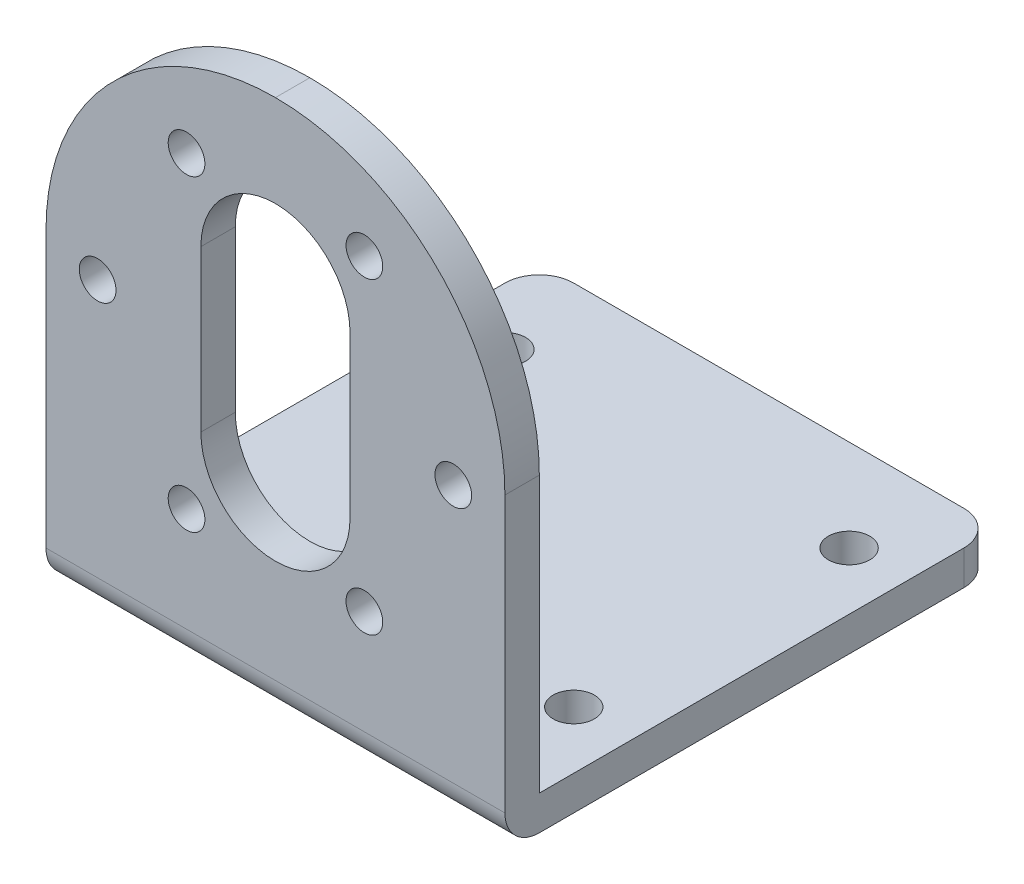
ISO-10303-21;
HEADER;
FILE_DESCRIPTION(('STEP AP214'),'2;1');
FILE_NAME('part.step','',(''),(''),'','','');
FILE_SCHEMA(('AUTOMOTIVE_DESIGN { 1 0 10303 214 1 1 1 1 }'));
ENDSEC;
DATA;
#1=APPLICATION_CONTEXT('core data for automotive mechanical design processes');
#2=APPLICATION_PROTOCOL_DEFINITION('international standard','automotive_design',2000,#1);
#3=PRODUCT_CONTEXT('',#1,'mechanical');
#4=PRODUCT('Part','Part','',(#3));
#5=PRODUCT_RELATED_PRODUCT_CATEGORY('part','',(#4));
#6=PRODUCT_DEFINITION_FORMATION('','',#4);
#7=PRODUCT_DEFINITION_CONTEXT('part definition',#1,'design');
#8=PRODUCT_DEFINITION('design','',#6,#7);
#9=PRODUCT_DEFINITION_SHAPE('','',#8);
#10=(LENGTH_UNIT() NAMED_UNIT(*) SI_UNIT(.MILLI.,.METRE.));
#11=(NAMED_UNIT(*) PLANE_ANGLE_UNIT() SI_UNIT($,.RADIAN.));
#12=(NAMED_UNIT(*) SI_UNIT($,.STERADIAN.) SOLID_ANGLE_UNIT());
#13=UNCERTAINTY_MEASURE_WITH_UNIT(LENGTH_MEASURE(1.E-05),#10,'distance_accuracy_value','');
#14=(GEOMETRIC_REPRESENTATION_CONTEXT(3) GLOBAL_UNCERTAINTY_ASSIGNED_CONTEXT((#13)) GLOBAL_UNIT_ASSIGNED_CONTEXT((#10,
#11,#12)) REPRESENTATION_CONTEXT('',''));
#15=CARTESIAN_POINT('',(0.,0.,0.));
#16=DIRECTION('',(0.,0.,1.));
#17=DIRECTION('',(1.,0.,0.));
#18=AXIS2_PLACEMENT_3D('',#15,#16,#17);
#19=CARTESIAN_POINT('',(0.,3.,0.));
#20=DIRECTION('',(0.,1.,0.));
#21=DIRECTION('',(0.,0.,1.));
#22=AXIS2_PLACEMENT_3D('',#19,#20,#21);
#23=PLANE('',#22);
#24=DIRECTION('',(-1.,0.,0.));
#25=VECTOR('',#24,1.);
#26=CARTESIAN_POINT('',(-20.,3.,-21.5));
#27=LINE('',#26,#25);
#28=CARTESIAN_POINT('',(17.,3.,-21.5));
#29=VERTEX_POINT('',#28);
#30=CARTESIAN_POINT('',(-17.,3.,-21.5));
#31=VERTEX_POINT('',#30);
#32=EDGE_CURVE('E270',#29,#31,#27,.T.);
#33=ORIENTED_EDGE('',*,*,#32,.T.);
#34=CARTESIAN_POINT('',(-17.,3.,-18.5));
#35=DIRECTION('',(0.,1.,0.));
#36=DIRECTION('',(0.,0.,1.));
#37=AXIS2_PLACEMENT_3D('',#34,#35,#36);
#38=CIRCLE('',#37,3.);
#39=CARTESIAN_POINT('',(-20.,3.,-18.5));
#40=VERTEX_POINT('',#39);
#41=EDGE_CURVE('E337',#31,#40,#38,.T.);
#42=ORIENTED_EDGE('',*,*,#41,.T.);
#43=DIRECTION('',(0.,0.,1.));
#44=VECTOR('',#43,1.);
#45=CARTESIAN_POINT('',(-20.,3.,-21.5));
#46=LINE('',#45,#44);
#47=CARTESIAN_POINT('',(-20.,3.,18.5));
#48=VERTEX_POINT('',#47);
#49=EDGE_CURVE('E262',#40,#48,#46,.T.);
#50=ORIENTED_EDGE('',*,*,#49,.T.);
#51=DIRECTION('',(-1.,0.,0.));
#52=VECTOR('',#51,1.);
#53=CARTESIAN_POINT('',(-20.,3.,18.5));
#54=LINE('',#53,#52);
#55=CARTESIAN_POINT('',(20.,3.,18.5));
#56=VERTEX_POINT('',#55);
#57=EDGE_CURVE('E218',#56,#48,#54,.T.);
#58=ORIENTED_EDGE('',*,*,#57,.F.);
#59=DIRECTION('',(0.,0.,-1.));
#60=VECTOR('',#59,1.);
#61=CARTESIAN_POINT('',(20.,3.,-21.5));
#62=LINE('',#61,#60);
#63=CARTESIAN_POINT('',(20.,3.,-18.5));
#64=VERTEX_POINT('',#63);
#65=EDGE_CURVE('E265',#56,#64,#62,.T.);
#66=ORIENTED_EDGE('',*,*,#65,.T.);
#67=CARTESIAN_POINT('',(17.,3.,-18.5));
#68=DIRECTION('',(0.,1.,0.));
#69=DIRECTION('',(0.,0.,1.));
#70=AXIS2_PLACEMENT_3D('',#67,#68,#69);
#71=CIRCLE('',#70,3.);
#72=EDGE_CURVE('E324',#64,#29,#71,.T.);
#73=ORIENTED_EDGE('',*,*,#72,.T.);
#74=EDGE_LOOP('',(#33,#42,#50,#58,#66,#73));
#75=FACE_BOUND('',#74,.T.);
#76=CARTESIAN_POINT('',(15.0000000000002,3.,10.4999999999996));
#77=DIRECTION('',(0.,1.,0.));
#78=DIRECTION('',(0.,0.,1.));
#79=AXIS2_PLACEMENT_3D('',#76,#77,#78);
#80=CIRCLE('',#79,1.8);
#81=CARTESIAN_POINT('',(15.0000000000002,3.,12.2999999999996));
#82=VERTEX_POINT('',#81);
#83=EDGE_CURVE('E238',#82,#82,#80,.T.);
#84=ORIENTED_EDGE('',*,*,#83,.F.);
#85=EDGE_LOOP('',(#84));
#86=FACE_BOUND('',#85,.T.);
#87=CARTESIAN_POINT('',(-15.,3.,-13.5));
#88=DIRECTION('',(0.,1.,0.));
#89=DIRECTION('',(0.,0.,1.));
#90=AXIS2_PLACEMENT_3D('',#87,#88,#89);
#91=CIRCLE('',#90,1.8);
#92=CARTESIAN_POINT('',(-15.,3.,-11.7));
#93=VERTEX_POINT('',#92);
#94=EDGE_CURVE('E254',#93,#93,#91,.T.);
#95=ORIENTED_EDGE('',*,*,#94,.F.);
#96=EDGE_LOOP('',(#95));
#97=FACE_BOUND('',#96,.T.);
#98=CARTESIAN_POINT('',(15.,3.,-13.5000000000004));
#99=DIRECTION('',(0.,1.,0.));
#100=DIRECTION('',(0.,0.,1.));
#101=AXIS2_PLACEMENT_3D('',#98,#99,#100);
#102=CIRCLE('',#101,1.8);
#103=CARTESIAN_POINT('',(15.,3.,-11.7000000000004));
#104=VERTEX_POINT('',#103);
#105=EDGE_CURVE('E246',#104,#104,#102,.T.);
#106=ORIENTED_EDGE('',*,*,#105,.F.);
#107=EDGE_LOOP('',(#106));
#108=FACE_BOUND('',#107,.T.);
#109=CARTESIAN_POINT('',(-14.9999999999998,3.,10.5));
#110=DIRECTION('',(0.,1.,0.));
#111=DIRECTION('',(0.,0.,1.));
#112=AXIS2_PLACEMENT_3D('',#109,#110,#111);
#113=CIRCLE('',#112,1.8);
#114=CARTESIAN_POINT('',(-14.9999999999998,3.,12.3));
#115=VERTEX_POINT('',#114);
#116=EDGE_CURVE('E230',#115,#115,#113,.T.);
#117=ORIENTED_EDGE('',*,*,#116,.F.);
#118=EDGE_LOOP('',(#117));
#119=FACE_BOUND('',#118,.T.);
#120=ADVANCED_FACE('F38',(#75,#86,#97,#108,#119),#23,.T.);
#121=CARTESIAN_POINT('',(0.,0.,0.));
#122=DIRECTION('',(0.,1.,0.));
#123=DIRECTION('',(0.,0.,1.));
#124=AXIS2_PLACEMENT_3D('',#121,#122,#123);
#125=PLANE('',#124);
#126=DIRECTION('',(0.,0.,-1.));
#127=VECTOR('',#126,1.);
#128=CARTESIAN_POINT('',(20.,0.,-21.5));
#129=LINE('',#128,#127);
#130=CARTESIAN_POINT('',(20.,0.,18.5));
#131=VERTEX_POINT('',#130);
#132=CARTESIAN_POINT('',(20.,0.,-18.5));
#133=VERTEX_POINT('',#132);
#134=EDGE_CURVE('E277',#131,#133,#129,.T.);
#135=ORIENTED_EDGE('',*,*,#134,.F.);
#136=DIRECTION('',(1.,0.,0.));
#137=VECTOR('',#136,1.);
#138=CARTESIAN_POINT('',(0.,0.,18.5));
#139=LINE('',#138,#137);
#140=CARTESIAN_POINT('',(-20.,0.,18.5));
#141=VERTEX_POINT('',#140);
#142=EDGE_CURVE('E47',#131,#141,#139,.F.);
#143=ORIENTED_EDGE('',*,*,#142,.T.);
#144=DIRECTION('',(0.,0.,1.));
#145=VECTOR('',#144,1.);
#146=CARTESIAN_POINT('',(-20.,0.,-21.5));
#147=LINE('',#146,#145);
#148=CARTESIAN_POINT('',(-20.,0.,-18.5));
#149=VERTEX_POINT('',#148);
#150=EDGE_CURVE('E258',#149,#141,#147,.T.);
#151=ORIENTED_EDGE('',*,*,#150,.F.);
#152=CARTESIAN_POINT('',(-17.,0.,-18.5));
#153=DIRECTION('',(0.,1.,0.));
#154=DIRECTION('',(0.,0.,1.));
#155=AXIS2_PLACEMENT_3D('',#152,#153,#154);
#156=CIRCLE('',#155,3.);
#157=CARTESIAN_POINT('',(-17.,0.,-21.5));
#158=VERTEX_POINT('',#157);
#159=EDGE_CURVE('E331',#149,#158,#156,.F.);
#160=ORIENTED_EDGE('',*,*,#159,.T.);
#161=DIRECTION('',(-1.,0.,0.));
#162=VECTOR('',#161,1.);
#163=CARTESIAN_POINT('',(-20.,0.,-21.5));
#164=LINE('',#163,#162);
#165=CARTESIAN_POINT('',(17.,0.,-21.5));
#166=VERTEX_POINT('',#165);
#167=EDGE_CURVE('E266',#166,#158,#164,.T.);
#168=ORIENTED_EDGE('',*,*,#167,.F.);
#169=CARTESIAN_POINT('',(17.,0.,-18.5));
#170=DIRECTION('',(0.,1.,0.));
#171=DIRECTION('',(0.,0.,1.));
#172=AXIS2_PLACEMENT_3D('',#169,#170,#171);
#173=CIRCLE('',#172,3.);
#174=EDGE_CURVE('E317',#166,#133,#173,.F.);
#175=ORIENTED_EDGE('',*,*,#174,.T.);
#176=EDGE_LOOP('',(#135,#143,#151,#160,#168,#175));
#177=FACE_BOUND('',#176,.T.);
#178=CARTESIAN_POINT('',(-15.,0.,-13.5));
#179=DIRECTION('',(0.,1.,0.));
#180=DIRECTION('',(0.,0.,1.));
#181=AXIS2_PLACEMENT_3D('',#178,#179,#180);
#182=CIRCLE('',#181,1.8);
#183=CARTESIAN_POINT('',(-15.,0.,-11.7));
#184=VERTEX_POINT('',#183);
#185=EDGE_CURVE('E250',#184,#184,#182,.T.);
#186=ORIENTED_EDGE('',*,*,#185,.T.);
#187=EDGE_LOOP('',(#186));
#188=FACE_BOUND('',#187,.T.);
#189=CARTESIAN_POINT('',(15.,0.,-13.5000000000004));
#190=DIRECTION('',(0.,1.,0.));
#191=DIRECTION('',(0.,0.,1.));
#192=AXIS2_PLACEMENT_3D('',#189,#190,#191);
#193=CIRCLE('',#192,1.8);
#194=CARTESIAN_POINT('',(15.,0.,-11.7000000000004));
#195=VERTEX_POINT('',#194);
#196=EDGE_CURVE('E242',#195,#195,#193,.T.);
#197=ORIENTED_EDGE('',*,*,#196,.T.);
#198=EDGE_LOOP('',(#197));
#199=FACE_BOUND('',#198,.T.);
#200=CARTESIAN_POINT('',(15.0000000000002,0.,10.4999999999996));
#201=DIRECTION('',(0.,1.,0.));
#202=DIRECTION('',(0.,0.,1.));
#203=AXIS2_PLACEMENT_3D('',#200,#201,#202);
#204=CIRCLE('',#203,1.8);
#205=CARTESIAN_POINT('',(15.0000000000002,0.,12.2999999999996));
#206=VERTEX_POINT('',#205);
#207=EDGE_CURVE('E234',#206,#206,#204,.T.);
#208=ORIENTED_EDGE('',*,*,#207,.T.);
#209=EDGE_LOOP('',(#208));
#210=FACE_BOUND('',#209,.T.);
#211=CARTESIAN_POINT('',(-14.9999999999998,0.,10.5));
#212=DIRECTION('',(0.,1.,0.));
#213=DIRECTION('',(0.,0.,1.));
#214=AXIS2_PLACEMENT_3D('',#211,#212,#213);
#215=CIRCLE('',#214,1.8);
#216=CARTESIAN_POINT('',(-14.9999999999998,0.,12.3));
#217=VERTEX_POINT('',#216);
#218=EDGE_CURVE('E229',#217,#217,#215,.T.);
#219=ORIENTED_EDGE('',*,*,#218,.T.);
#220=EDGE_LOOP('',(#219));
#221=FACE_BOUND('',#220,.T.);
#222=ADVANCED_FACE('F378',(#177,#188,#199,#210,#221),#125,.F.);
#223=CARTESIAN_POINT('',(-20.,3.,-21.5));
#224=DIRECTION('',(1.,0.,0.));
#225=DIRECTION('',(0.,0.,-1.));
#226=AXIS2_PLACEMENT_3D('',#223,#224,#225);
#227=PLANE('',#226);
#228=ORIENTED_EDGE('',*,*,#150,.T.);
#229=CARTESIAN_POINT('',(-20.,3.,18.5));
#230=DIRECTION('',(1.,0.,0.));
#231=DIRECTION('',(0.,0.,-1.));
#232=AXIS2_PLACEMENT_3D('',#229,#230,#231);
#233=CIRCLE('',#232,3.);
#234=CARTESIAN_POINT('',(-20.,3.,21.5));
#235=VERTEX_POINT('',#234);
#236=EDGE_CURVE('E11',#141,#235,#233,.F.);
#237=ORIENTED_EDGE('',*,*,#236,.T.);
#238=DIRECTION('',(0.,-1.,0.));
#239=VECTOR('',#238,1.);
#240=CARTESIAN_POINT('',(-20.,3.,21.5));
#241=LINE('',#240,#239);
#242=CARTESIAN_POINT('',(-20.,27.,21.5));
#243=VERTEX_POINT('',#242);
#244=EDGE_CURVE('E285',#243,#235,#241,.T.);
#245=ORIENTED_EDGE('',*,*,#244,.F.);
#246=DIRECTION('',(0.,0.,1.));
#247=VECTOR('',#246,1.);
#248=CARTESIAN_POINT('',(-20.,27.,18.5));
#249=LINE('',#248,#247);
#250=CARTESIAN_POINT('',(-20.,27.,18.5));
#251=VERTEX_POINT('',#250);
#252=EDGE_CURVE('E295',#243,#251,#249,.F.);
#253=ORIENTED_EDGE('',*,*,#252,.T.);
#254=DIRECTION('',(0.,-1.,0.));
#255=VECTOR('',#254,1.);
#256=CARTESIAN_POINT('',(-20.,47.,18.5));
#257=LINE('',#256,#255);
#258=EDGE_CURVE('E222',#251,#48,#257,.T.);
#259=ORIENTED_EDGE('',*,*,#258,.T.);
#260=ORIENTED_EDGE('',*,*,#49,.F.);
#261=DIRECTION('',(0.,-1.,0.));
#262=VECTOR('',#261,1.);
#263=CARTESIAN_POINT('',(-20.,3.,-18.5));
#264=LINE('',#263,#262);
#265=EDGE_CURVE('E327',#40,#149,#264,.T.);
#266=ORIENTED_EDGE('',*,*,#265,.T.);
#267=EDGE_LOOP('',(#228,#237,#245,#253,#259,#260,#266));
#268=FACE_BOUND('',#267,.T.);
#269=ADVANCED_FACE('F366',(#268),#227,.F.);
#270=CARTESIAN_POINT('',(-20.,3.,21.5));
#271=DIRECTION('',(0.,0.,-1.));
#272=DIRECTION('',(-1.,0.,0.));
#273=AXIS2_PLACEMENT_3D('',#270,#271,#272);
#274=PLANE('',#273);
#275=CARTESIAN_POINT('',(7.75000000000006,12.0766062413412,21.5));
#276=DIRECTION('',(0.,0.,-1.));
#277=DIRECTION('',(-1.,0.,0.));
#278=AXIS2_PLACEMENT_3D('',#275,#276,#277);
#279=CIRCLE('',#278,1.6);
#280=CARTESIAN_POINT('',(6.15000000000006,12.0766062413412,21.5));
#281=VERTEX_POINT('',#280);
#282=EDGE_CURVE('E214',#281,#281,#279,.T.);
#283=ORIENTED_EDGE('',*,*,#282,.T.);
#284=EDGE_LOOP('',(#283));
#285=FACE_BOUND('',#284,.T.);
#286=CARTESIAN_POINT('',(7.75000000000007,38.9233937586588,21.5));
#287=DIRECTION('',(0.,0.,-1.));
#288=DIRECTION('',(-1.,0.,0.));
#289=AXIS2_PLACEMENT_3D('',#286,#287,#288);
#290=CIRCLE('',#289,1.6);
#291=CARTESIAN_POINT('',(6.15000000000007,38.9233937586588,21.5));
#292=VERTEX_POINT('',#291);
#293=EDGE_CURVE('E210',#292,#292,#290,.T.);
#294=ORIENTED_EDGE('',*,*,#293,.T.);
#295=EDGE_LOOP('',(#294));
#296=FACE_BOUND('',#295,.T.);
#297=CARTESIAN_POINT('',(15.5,25.5,21.5));
#298=DIRECTION('',(0.,0.,-1.));
#299=DIRECTION('',(-1.,0.,0.));
#300=AXIS2_PLACEMENT_3D('',#297,#298,#299);
#301=CIRCLE('',#300,1.6);
#302=CARTESIAN_POINT('',(13.9,25.5,21.5));
#303=VERTEX_POINT('',#302);
#304=EDGE_CURVE('E206',#303,#303,#301,.T.);
#305=ORIENTED_EDGE('',*,*,#304,.T.);
#306=EDGE_LOOP('',(#305));
#307=FACE_BOUND('',#306,.T.);
#308=CARTESIAN_POINT('',(-15.5,25.5,21.5));
#309=DIRECTION('',(0.,0.,-1.));
#310=DIRECTION('',(-1.,0.,0.));
#311=AXIS2_PLACEMENT_3D('',#308,#309,#310);
#312=CIRCLE('',#311,1.6);
#313=CARTESIAN_POINT('',(-17.1,25.5,21.5));
#314=VERTEX_POINT('',#313);
#315=EDGE_CURVE('E202',#314,#314,#312,.T.);
#316=ORIENTED_EDGE('',*,*,#315,.T.);
#317=EDGE_LOOP('',(#316));
#318=FACE_BOUND('',#317,.T.);
#319=CARTESIAN_POINT('',(-7.75000000000006,12.0766062413412,21.5));
#320=DIRECTION('',(0.,0.,-1.));
#321=DIRECTION('',(-1.,0.,0.));
#322=AXIS2_PLACEMENT_3D('',#319,#320,#321);
#323=CIRCLE('',#322,1.6);
#324=CARTESIAN_POINT('',(-9.35000000000006,12.0766062413412,21.5));
#325=VERTEX_POINT('',#324);
#326=EDGE_CURVE('E198',#325,#325,#323,.T.);
#327=ORIENTED_EDGE('',*,*,#326,.T.);
#328=EDGE_LOOP('',(#327));
#329=FACE_BOUND('',#328,.T.);
#330=CARTESIAN_POINT('',(-7.75000000000007,38.9233937586588,21.5));
#331=DIRECTION('',(0.,0.,-1.));
#332=DIRECTION('',(-1.,0.,0.));
#333=AXIS2_PLACEMENT_3D('',#330,#331,#332);
#334=CIRCLE('',#333,1.6);
#335=CARTESIAN_POINT('',(-9.35000000000007,38.9233937586588,21.5));
#336=VERTEX_POINT('',#335);
#337=EDGE_CURVE('E194',#336,#336,#334,.T.);
#338=ORIENTED_EDGE('',*,*,#337,.T.);
#339=EDGE_LOOP('',(#338));
#340=FACE_BOUND('',#339,.T.);
#341=DIRECTION('',(0.,1.,0.));
#342=VECTOR('',#341,1.);
#343=CARTESIAN_POINT('',(-6.5,3.,21.5));
#344=LINE('',#343,#342);
#345=CARTESIAN_POINT('',(-6.5,18.5,21.5));
#346=VERTEX_POINT('',#345);
#347=CARTESIAN_POINT('',(-6.5,32.5,21.5));
#348=VERTEX_POINT('',#347);
#349=EDGE_CURVE('E186',#346,#348,#344,.T.);
#350=ORIENTED_EDGE('',*,*,#349,.T.);
#351=CARTESIAN_POINT('',(0.,32.5,21.5));
#352=DIRECTION('',(0.,0.,-1.));
#353=DIRECTION('',(-1.,0.,0.));
#354=AXIS2_PLACEMENT_3D('',#351,#352,#353);
#355=CIRCLE('',#354,6.5);
#356=CARTESIAN_POINT('',(6.5,32.5,21.5));
#357=VERTEX_POINT('',#356);
#358=EDGE_CURVE('E190',#348,#357,#355,.T.);
#359=ORIENTED_EDGE('',*,*,#358,.T.);
#360=DIRECTION('',(0.,-1.,0.));
#361=VECTOR('',#360,1.);
#362=CARTESIAN_POINT('',(6.49999999999999,3.,21.5));
#363=LINE('',#362,#361);
#364=CARTESIAN_POINT('',(6.49999999999999,18.5,21.5));
#365=VERTEX_POINT('',#364);
#366=EDGE_CURVE('E177',#357,#365,#363,.T.);
#367=ORIENTED_EDGE('',*,*,#366,.T.);
#368=CARTESIAN_POINT('',(0.,18.5,21.5));
#369=DIRECTION('',(0.,0.,-1.));
#370=DIRECTION('',(-1.,0.,0.));
#371=AXIS2_PLACEMENT_3D('',#368,#369,#370);
#372=CIRCLE('',#371,6.5);
#373=EDGE_CURVE('E147',#365,#346,#372,.T.);
#374=ORIENTED_EDGE('',*,*,#373,.T.);
#375=EDGE_LOOP('',(#350,#359,#367,#374));
#376=FACE_BOUND('',#375,.T.);
#377=ORIENTED_EDGE('',*,*,#244,.T.);
#378=DIRECTION('',(1.,0.,0.));
#379=VECTOR('',#378,1.);
#380=CARTESIAN_POINT('',(-20.,3.,21.5));
#381=LINE('',#380,#379);
#382=CARTESIAN_POINT('',(20.,3.,21.5));
#383=VERTEX_POINT('',#382);
#384=EDGE_CURVE('E340',#235,#383,#381,.T.);
#385=ORIENTED_EDGE('',*,*,#384,.T.);
#386=DIRECTION('',(0.,-1.,0.));
#387=VECTOR('',#386,1.);
#388=CARTESIAN_POINT('',(20.,3.,21.5));
#389=LINE('',#388,#387);
#390=CARTESIAN_POINT('',(20.,27.,21.5));
#391=VERTEX_POINT('',#390);
#392=EDGE_CURVE('E274',#391,#383,#389,.T.);
#393=ORIENTED_EDGE('',*,*,#392,.F.);
#394=CARTESIAN_POINT('',(0.,27.,21.5));
#395=DIRECTION('',(0.,0.,-1.));
#396=DIRECTION('',(-1.,0.,0.));
#397=AXIS2_PLACEMENT_3D('',#394,#395,#396);
#398=CIRCLE('',#397,20.);
#399=CARTESIAN_POINT('',(0.,47.,21.5));
#400=VERTEX_POINT('',#399);
#401=EDGE_CURVE('E289',#391,#400,#398,.F.);
#402=ORIENTED_EDGE('',*,*,#401,.T.);
#403=CARTESIAN_POINT('',(0.,27.,21.5));
#404=DIRECTION('',(0.,0.,-1.));
#405=DIRECTION('',(-1.,0.,0.));
#406=AXIS2_PLACEMENT_3D('',#403,#404,#405);
#407=CIRCLE('',#406,20.);
#408=EDGE_CURVE('E292',#400,#243,#407,.F.);
#409=ORIENTED_EDGE('',*,*,#408,.T.);
#410=EDGE_LOOP('',(#377,#385,#393,#402,#409));
#411=FACE_BOUND('',#410,.T.);
#412=ADVANCED_FACE('F349',(#285,#296,#307,#318,#329,#340,#376,#411),#274,.F.);
#413=CARTESIAN_POINT('',(20.,3.,-21.5));
#414=DIRECTION('',(-1.,0.,0.));
#415=DIRECTION('',(0.,0.,1.));
#416=AXIS2_PLACEMENT_3D('',#413,#414,#415);
#417=PLANE('',#416);
#418=ORIENTED_EDGE('',*,*,#392,.T.);
#419=CARTESIAN_POINT('',(20.,3.,18.5));
#420=DIRECTION('',(-1.,0.,0.));
#421=DIRECTION('',(0.,0.,1.));
#422=AXIS2_PLACEMENT_3D('',#419,#420,#421);
#423=CIRCLE('',#422,3.);
#424=EDGE_CURVE('E61',#383,#131,#423,.F.);
#425=ORIENTED_EDGE('',*,*,#424,.T.);
#426=ORIENTED_EDGE('',*,*,#134,.T.);
#427=DIRECTION('',(0.,-1.,0.));
#428=VECTOR('',#427,1.);
#429=CARTESIAN_POINT('',(20.,3.,-18.5));
#430=LINE('',#429,#428);
#431=EDGE_CURVE('E321',#133,#64,#430,.F.);
#432=ORIENTED_EDGE('',*,*,#431,.T.);
#433=ORIENTED_EDGE('',*,*,#65,.F.);
#434=DIRECTION('',(0.,-1.,0.));
#435=VECTOR('',#434,1.);
#436=CARTESIAN_POINT('',(20.,47.,18.5));
#437=LINE('',#436,#435);
#438=CARTESIAN_POINT('',(20.,27.,18.5));
#439=VERTEX_POINT('',#438);
#440=EDGE_CURVE('E226',#439,#56,#437,.T.);
#441=ORIENTED_EDGE('',*,*,#440,.F.);
#442=DIRECTION('',(0.,0.,-1.));
#443=VECTOR('',#442,1.);
#444=CARTESIAN_POINT('',(20.,27.,21.5));
#445=LINE('',#444,#443);
#446=EDGE_CURVE('E305',#439,#391,#445,.F.);
#447=ORIENTED_EDGE('',*,*,#446,.T.);
#448=EDGE_LOOP('',(#418,#425,#426,#432,#433,#441,#447));
#449=FACE_BOUND('',#448,.T.);
#450=ADVANCED_FACE('F354',(#449),#417,.F.);
#451=CARTESIAN_POINT('',(-20.,3.,-21.5));
#452=DIRECTION('',(0.,0.,1.));
#453=DIRECTION('',(1.,0.,0.));
#454=AXIS2_PLACEMENT_3D('',#451,#452,#453);
#455=PLANE('',#454);
#456=ORIENTED_EDGE('',*,*,#167,.T.);
#457=DIRECTION('',(0.,-1.,0.));
#458=VECTOR('',#457,1.);
#459=CARTESIAN_POINT('',(-17.,3.,-21.5));
#460=LINE('',#459,#458);
#461=EDGE_CURVE('E334',#158,#31,#460,.F.);
#462=ORIENTED_EDGE('',*,*,#461,.T.);
#463=ORIENTED_EDGE('',*,*,#32,.F.);
#464=DIRECTION('',(0.,-1.,0.));
#465=VECTOR('',#464,1.);
#466=CARTESIAN_POINT('',(17.,3.,-21.5));
#467=LINE('',#466,#465);
#468=EDGE_CURVE('E308',#29,#166,#467,.T.);
#469=ORIENTED_EDGE('',*,*,#468,.T.);
#470=EDGE_LOOP('',(#456,#462,#463,#469));
#471=FACE_BOUND('',#470,.T.);
#472=ADVANCED_FACE('F381',(#471),#455,.F.);
#473=CARTESIAN_POINT('',(-15.,3.,-13.5));
#474=DIRECTION('',(0.,-1.,0.));
#475=DIRECTION('',(0.,0.,-1.));
#476=AXIS2_PLACEMENT_3D('',#473,#474,#475);
#477=CYLINDRICAL_SURFACE('',#476,1.8);
#478=ORIENTED_EDGE('',*,*,#94,.T.);
#479=EDGE_LOOP('',(#478));
#480=FACE_BOUND('',#479,.T.);
#481=ORIENTED_EDGE('',*,*,#185,.F.);
#482=EDGE_LOOP('',(#481));
#483=FACE_BOUND('',#482,.T.);
#484=ADVANCED_FACE('F402',(#480,#483),#477,.F.);
#485=CARTESIAN_POINT('',(15.,3.,-13.5000000000004));
#486=DIRECTION('',(0.,-1.,0.));
#487=DIRECTION('',(0.,0.,-1.));
#488=AXIS2_PLACEMENT_3D('',#485,#486,#487);
#489=CYLINDRICAL_SURFACE('',#488,1.8);
#490=ORIENTED_EDGE('',*,*,#105,.T.);
#491=EDGE_LOOP('',(#490));
#492=FACE_BOUND('',#491,.T.);
#493=ORIENTED_EDGE('',*,*,#196,.F.);
#494=EDGE_LOOP('',(#493));
#495=FACE_BOUND('',#494,.T.);
#496=ADVANCED_FACE('F465',(#492,#495),#489,.F.);
#497=CARTESIAN_POINT('',(15.0000000000002,3.,10.4999999999996));
#498=DIRECTION('',(0.,-1.,0.));
#499=DIRECTION('',(0.,0.,-1.));
#500=AXIS2_PLACEMENT_3D('',#497,#498,#499);
#501=CYLINDRICAL_SURFACE('',#500,1.8);
#502=ORIENTED_EDGE('',*,*,#83,.T.);
#503=EDGE_LOOP('',(#502));
#504=FACE_BOUND('',#503,.T.);
#505=ORIENTED_EDGE('',*,*,#207,.F.);
#506=EDGE_LOOP('',(#505));
#507=FACE_BOUND('',#506,.T.);
#508=ADVANCED_FACE('F471',(#504,#507),#501,.F.);
#509=CARTESIAN_POINT('',(-14.9999999999998,3.,10.5));
#510=DIRECTION('',(0.,-1.,0.));
#511=DIRECTION('',(0.,0.,-1.));
#512=AXIS2_PLACEMENT_3D('',#509,#510,#511);
#513=CYLINDRICAL_SURFACE('',#512,1.8);
#514=ORIENTED_EDGE('',*,*,#116,.T.);
#515=EDGE_LOOP('',(#514));
#516=FACE_BOUND('',#515,.T.);
#517=ORIENTED_EDGE('',*,*,#218,.F.);
#518=EDGE_LOOP('',(#517));
#519=FACE_BOUND('',#518,.T.);
#520=ADVANCED_FACE('F478',(#516,#519),#513,.F.);
#521=CARTESIAN_POINT('',(-20.,47.,18.5));
#522=DIRECTION('',(0.,0.,1.));
#523=DIRECTION('',(1.,0.,0.));
#524=AXIS2_PLACEMENT_3D('',#521,#522,#523);
#525=PLANE('',#524);
#526=CARTESIAN_POINT('',(7.75000000000006,12.0766062413412,18.5));
#527=DIRECTION('',(0.,0.,-1.));
#528=DIRECTION('',(-1.,0.,0.));
#529=AXIS2_PLACEMENT_3D('',#526,#527,#528);
#530=CIRCLE('',#529,1.6);
#531=CARTESIAN_POINT('',(6.15000000000006,12.0766062413412,18.5));
#532=VERTEX_POINT('',#531);
#533=EDGE_CURVE('E607',#532,#532,#530,.T.);
#534=ORIENTED_EDGE('',*,*,#533,.F.);
#535=EDGE_LOOP('',(#534));
#536=FACE_BOUND('',#535,.T.);
#537=CARTESIAN_POINT('',(7.75000000000007,38.9233937586588,18.5));
#538=DIRECTION('',(0.,0.,-1.));
#539=DIRECTION('',(-1.,0.,0.));
#540=AXIS2_PLACEMENT_3D('',#537,#538,#539);
#541=CIRCLE('',#540,1.6);
#542=CARTESIAN_POINT('',(6.15000000000007,38.9233937586588,18.5));
#543=VERTEX_POINT('',#542);
#544=EDGE_CURVE('E630',#543,#543,#541,.T.);
#545=ORIENTED_EDGE('',*,*,#544,.F.);
#546=EDGE_LOOP('',(#545));
#547=FACE_BOUND('',#546,.T.);
#548=CARTESIAN_POINT('',(15.5,25.5,18.5));
#549=DIRECTION('',(0.,0.,-1.));
#550=DIRECTION('',(1.,0.,0.));
#551=AXIS2_PLACEMENT_3D('',#548,#549,#550);
#552=CIRCLE('',#551,1.6);
#553=CARTESIAN_POINT('',(17.1,25.5,18.5));
#554=VERTEX_POINT('',#553);
#555=EDGE_CURVE('E625',#554,#554,#552,.T.);
#556=ORIENTED_EDGE('',*,*,#555,.F.);
#557=EDGE_LOOP('',(#556));
#558=FACE_BOUND('',#557,.T.);
#559=CARTESIAN_POINT('',(-15.5,25.5,18.5));
#560=DIRECTION('',(0.,0.,-1.));
#561=DIRECTION('',(-1.,0.,0.));
#562=AXIS2_PLACEMENT_3D('',#559,#560,#561);
#563=CIRCLE('',#562,1.6);
#564=CARTESIAN_POINT('',(-17.1,25.5,18.5));
#565=VERTEX_POINT('',#564);
#566=EDGE_CURVE('E622',#565,#565,#563,.T.);
#567=ORIENTED_EDGE('',*,*,#566,.F.);
#568=EDGE_LOOP('',(#567));
#569=FACE_BOUND('',#568,.T.);
#570=CARTESIAN_POINT('',(-7.75000000000006,12.0766062413412,18.5));
#571=DIRECTION('',(0.,0.,-1.));
#572=DIRECTION('',(1.,0.,0.));
#573=AXIS2_PLACEMENT_3D('',#570,#571,#572);
#574=CIRCLE('',#573,1.6);
#575=CARTESIAN_POINT('',(-6.15000000000006,12.0766062413412,18.5));
#576=VERTEX_POINT('',#575);
#577=EDGE_CURVE('E634',#576,#576,#574,.T.);
#578=ORIENTED_EDGE('',*,*,#577,.F.);
#579=EDGE_LOOP('',(#578));
#580=FACE_BOUND('',#579,.T.);
#581=CARTESIAN_POINT('',(-7.75000000000007,38.9233937586588,18.5));
#582=DIRECTION('',(0.,0.,-1.));
#583=DIRECTION('',(1.,0.,0.));
#584=AXIS2_PLACEMENT_3D('',#581,#582,#583);
#585=CIRCLE('',#584,1.6);
#586=CARTESIAN_POINT('',(-6.15000000000007,38.9233937586588,18.5));
#587=VERTEX_POINT('',#586);
#588=EDGE_CURVE('E313',#587,#587,#585,.T.);
#589=ORIENTED_EDGE('',*,*,#588,.F.);
#590=EDGE_LOOP('',(#589));
#591=FACE_BOUND('',#590,.T.);
#592=DIRECTION('',(0.,-1.,0.));
#593=VECTOR('',#592,1.);
#594=CARTESIAN_POINT('',(6.5,32.5,18.5));
#595=LINE('',#594,#593);
#596=CARTESIAN_POINT('',(6.5,32.5,18.5));
#597=VERTEX_POINT('',#596);
#598=CARTESIAN_POINT('',(6.5,18.5,18.5));
#599=VERTEX_POINT('',#598);
#600=EDGE_CURVE('E156',#597,#599,#595,.T.);
#601=ORIENTED_EDGE('',*,*,#600,.F.);
#602=CARTESIAN_POINT('',(0.,32.5,18.5));
#603=DIRECTION('',(0.,0.,-1.));
#604=DIRECTION('',(-1.,0.,0.));
#605=AXIS2_PLACEMENT_3D('',#602,#603,#604);
#606=CIRCLE('',#605,6.5);
#607=CARTESIAN_POINT('',(-6.5,32.5,18.5));
#608=VERTEX_POINT('',#607);
#609=EDGE_CURVE('E162',#608,#597,#606,.T.);
#610=ORIENTED_EDGE('',*,*,#609,.F.);
#611=DIRECTION('',(0.,1.,0.));
#612=VECTOR('',#611,1.);
#613=CARTESIAN_POINT('',(-6.5,32.5,18.5));
#614=LINE('',#613,#612);
#615=CARTESIAN_POINT('',(-6.5,18.5,18.5));
#616=VERTEX_POINT('',#615);
#617=EDGE_CURVE('E167',#616,#608,#614,.T.);
#618=ORIENTED_EDGE('',*,*,#617,.F.);
#619=CARTESIAN_POINT('',(0.,18.5,18.5));
#620=DIRECTION('',(0.,0.,-1.));
#621=DIRECTION('',(-1.,0.,0.));
#622=AXIS2_PLACEMENT_3D('',#619,#620,#621);
#623=CIRCLE('',#622,6.5);
#624=EDGE_CURVE('E144',#599,#616,#623,.T.);
#625=ORIENTED_EDGE('',*,*,#624,.F.);
#626=EDGE_LOOP('',(#601,#610,#618,#625));
#627=FACE_BOUND('',#626,.T.);
#628=ORIENTED_EDGE('',*,*,#258,.F.);
#629=CARTESIAN_POINT('',(0.,27.,18.5));
#630=DIRECTION('',(0.,0.,1.));
#631=DIRECTION('',(1.,0.,0.));
#632=AXIS2_PLACEMENT_3D('',#629,#630,#631);
#633=CIRCLE('',#632,20.);
#634=CARTESIAN_POINT('',(0.,47.,18.5));
#635=VERTEX_POINT('',#634);
#636=EDGE_CURVE('E302',#251,#635,#633,.F.);
#637=ORIENTED_EDGE('',*,*,#636,.T.);
#638=CARTESIAN_POINT('',(0.,27.,18.5));
#639=DIRECTION('',(0.,0.,1.));
#640=DIRECTION('',(1.,0.,0.));
#641=AXIS2_PLACEMENT_3D('',#638,#639,#640);
#642=CIRCLE('',#641,20.);
#643=EDGE_CURVE('E299',#635,#439,#642,.F.);
#644=ORIENTED_EDGE('',*,*,#643,.T.);
#645=ORIENTED_EDGE('',*,*,#440,.T.);
#646=ORIENTED_EDGE('',*,*,#57,.T.);
#647=EDGE_LOOP('',(#628,#637,#644,#645,#646));
#648=FACE_BOUND('',#647,.T.);
#649=ADVANCED_FACE('F164',(#536,#547,#558,#569,#580,#591,#627,#648),#525,.F.);
#650=CARTESIAN_POINT('',(0.,32.5,62.5));
#651=DIRECTION('',(0.,0.,-1.));
#652=DIRECTION('',(-1.,0.,0.));
#653=AXIS2_PLACEMENT_3D('',#650,#651,#652);
#654=CYLINDRICAL_SURFACE('',#653,6.5);
#655=DIRECTION('',(0.,0.,-1.));
#656=VECTOR('',#655,1.);
#657=CARTESIAN_POINT('',(-6.50000000000001,32.5,62.5));
#658=LINE('',#657,#656);
#659=EDGE_CURVE('E174',#348,#608,#658,.T.);
#660=ORIENTED_EDGE('',*,*,#659,.T.);
#661=ORIENTED_EDGE('',*,*,#609,.T.);
#662=DIRECTION('',(0.,0.,-1.));
#663=VECTOR('',#662,1.);
#664=CARTESIAN_POINT('',(6.5,32.5,62.5));
#665=LINE('',#664,#663);
#666=EDGE_CURVE('E152',#357,#597,#665,.T.);
#667=ORIENTED_EDGE('',*,*,#666,.F.);
#668=ORIENTED_EDGE('',*,*,#358,.F.);
#669=EDGE_LOOP('',(#660,#661,#667,#668));
#670=FACE_BOUND('',#669,.T.);
#671=ADVANCED_FACE('F494',(#670),#654,.F.);
#672=CARTESIAN_POINT('',(-6.50000000000001,32.5,62.5));
#673=DIRECTION('',(-1.,0.,0.));
#674=DIRECTION('',(0.,0.,1.));
#675=AXIS2_PLACEMENT_3D('',#672,#673,#674);
#676=PLANE('',#675);
#677=DIRECTION('',(0.,0.,-1.));
#678=VECTOR('',#677,1.);
#679=CARTESIAN_POINT('',(-6.50000000000001,18.5,62.5));
#680=LINE('',#679,#678);
#681=EDGE_CURVE('E151',#346,#616,#680,.T.);
#682=ORIENTED_EDGE('',*,*,#681,.T.);
#683=ORIENTED_EDGE('',*,*,#617,.T.);
#684=ORIENTED_EDGE('',*,*,#659,.F.);
#685=ORIENTED_EDGE('',*,*,#349,.F.);
#686=EDGE_LOOP('',(#682,#683,#684,#685));
#687=FACE_BOUND('',#686,.T.);
#688=ADVANCED_FACE('F502',(#687),#676,.F.);
#689=CARTESIAN_POINT('',(0.,18.5,62.5));
#690=DIRECTION('',(0.,0.,-1.));
#691=DIRECTION('',(-1.,0.,0.));
#692=AXIS2_PLACEMENT_3D('',#689,#690,#691);
#693=CYLINDRICAL_SURFACE('',#692,6.5);
#694=DIRECTION('',(0.,0.,-1.));
#695=VECTOR('',#694,1.);
#696=CARTESIAN_POINT('',(6.49999999999999,18.5,62.5));
#697=LINE('',#696,#695);
#698=EDGE_CURVE('E139',#365,#599,#697,.T.);
#699=ORIENTED_EDGE('',*,*,#698,.T.);
#700=ORIENTED_EDGE('',*,*,#624,.T.);
#701=ORIENTED_EDGE('',*,*,#681,.F.);
#702=ORIENTED_EDGE('',*,*,#373,.F.);
#703=EDGE_LOOP('',(#699,#700,#701,#702));
#704=FACE_BOUND('',#703,.T.);
#705=ADVANCED_FACE('F141',(#704),#693,.F.);
#706=CARTESIAN_POINT('',(6.5,32.5,62.5));
#707=DIRECTION('',(1.,0.,0.));
#708=DIRECTION('',(0.,1.,0.));
#709=AXIS2_PLACEMENT_3D('',#706,#707,#708);
#710=PLANE('',#709);
#711=ORIENTED_EDGE('',*,*,#666,.T.);
#712=ORIENTED_EDGE('',*,*,#600,.T.);
#713=ORIENTED_EDGE('',*,*,#698,.F.);
#714=ORIENTED_EDGE('',*,*,#366,.F.);
#715=EDGE_LOOP('',(#711,#712,#713,#714));
#716=FACE_BOUND('',#715,.T.);
#717=ADVANCED_FACE('F157',(#716),#710,.F.);
#718=CARTESIAN_POINT('',(-7.75000000000007,38.9233937586588,62.5));
#719=DIRECTION('',(0.,0.,-1.));
#720=DIRECTION('',(-1.,0.,0.));
#721=AXIS2_PLACEMENT_3D('',#718,#719,#720);
#722=CYLINDRICAL_SURFACE('',#721,1.6);
#723=ORIENTED_EDGE('',*,*,#588,.T.);
#724=EDGE_LOOP('',(#723));
#725=FACE_BOUND('',#724,.T.);
#726=ORIENTED_EDGE('',*,*,#337,.F.);
#727=EDGE_LOOP('',(#726));
#728=FACE_BOUND('',#727,.T.);
#729=ADVANCED_FACE('F523',(#725,#728),#722,.F.);
#730=CARTESIAN_POINT('',(-7.75000000000006,12.0766062413412,62.5));
#731=DIRECTION('',(0.,0.,-1.));
#732=DIRECTION('',(-1.,0.,0.));
#733=AXIS2_PLACEMENT_3D('',#730,#731,#732);
#734=CYLINDRICAL_SURFACE('',#733,1.6);
#735=ORIENTED_EDGE('',*,*,#577,.T.);
#736=EDGE_LOOP('',(#735));
#737=FACE_BOUND('',#736,.T.);
#738=ORIENTED_EDGE('',*,*,#326,.F.);
#739=EDGE_LOOP('',(#738));
#740=FACE_BOUND('',#739,.T.);
#741=ADVANCED_FACE('F530',(#737,#740),#734,.F.);
#742=CARTESIAN_POINT('',(-15.5,25.5,62.5));
#743=DIRECTION('',(0.,0.,-1.));
#744=DIRECTION('',(-1.,0.,0.));
#745=AXIS2_PLACEMENT_3D('',#742,#743,#744);
#746=CYLINDRICAL_SURFACE('',#745,1.6);
#747=ORIENTED_EDGE('',*,*,#566,.T.);
#748=EDGE_LOOP('',(#747));
#749=FACE_BOUND('',#748,.T.);
#750=ORIENTED_EDGE('',*,*,#315,.F.);
#751=EDGE_LOOP('',(#750));
#752=FACE_BOUND('',#751,.T.);
#753=ADVANCED_FACE('F538',(#749,#752),#746,.F.);
#754=CARTESIAN_POINT('',(15.5,25.5,62.5));
#755=DIRECTION('',(0.,0.,-1.));
#756=DIRECTION('',(-1.,0.,0.));
#757=AXIS2_PLACEMENT_3D('',#754,#755,#756);
#758=CYLINDRICAL_SURFACE('',#757,1.6);
#759=ORIENTED_EDGE('',*,*,#555,.T.);
#760=EDGE_LOOP('',(#759));
#761=FACE_BOUND('',#760,.T.);
#762=ORIENTED_EDGE('',*,*,#304,.F.);
#763=EDGE_LOOP('',(#762));
#764=FACE_BOUND('',#763,.T.);
#765=ADVANCED_FACE('F546',(#761,#764),#758,.F.);
#766=CARTESIAN_POINT('',(7.75000000000006,38.9233937586588,62.5));
#767=DIRECTION('',(0.,0.,-1.));
#768=DIRECTION('',(-1.,0.,0.));
#769=AXIS2_PLACEMENT_3D('',#766,#767,#768);
#770=CYLINDRICAL_SURFACE('',#769,1.6);
#771=ORIENTED_EDGE('',*,*,#544,.T.);
#772=EDGE_LOOP('',(#771));
#773=FACE_BOUND('',#772,.T.);
#774=ORIENTED_EDGE('',*,*,#293,.F.);
#775=EDGE_LOOP('',(#774));
#776=FACE_BOUND('',#775,.T.);
#777=ADVANCED_FACE('F554',(#773,#776),#770,.F.);
#778=CARTESIAN_POINT('',(7.75000000000005,12.0766062413412,62.5));
#779=DIRECTION('',(0.,0.,-1.));
#780=DIRECTION('',(-1.,0.,0.));
#781=AXIS2_PLACEMENT_3D('',#778,#779,#780);
#782=CYLINDRICAL_SURFACE('',#781,1.6);
#783=ORIENTED_EDGE('',*,*,#533,.T.);
#784=EDGE_LOOP('',(#783));
#785=FACE_BOUND('',#784,.T.);
#786=ORIENTED_EDGE('',*,*,#282,.F.);
#787=EDGE_LOOP('',(#786));
#788=FACE_BOUND('',#787,.T.);
#789=ADVANCED_FACE('F417',(#785,#788),#782,.F.);
#790=CARTESIAN_POINT('',(0.,27.,0.));
#791=DIRECTION('',(0.,0.,1.));
#792=DIRECTION('',(1.,0.,0.));
#793=AXIS2_PLACEMENT_3D('',#790,#791,#792);
#794=CYLINDRICAL_SURFACE('',#793,20.);
#795=ORIENTED_EDGE('',*,*,#446,.F.);
#796=ORIENTED_EDGE('',*,*,#643,.F.);
#797=DIRECTION('',(0.,0.,-1.));
#798=VECTOR('',#797,1.);
#799=CARTESIAN_POINT('',(0.,47.,18.5));
#800=LINE('',#799,#798);
#801=EDGE_CURVE('E309',#400,#635,#800,.T.);
#802=ORIENTED_EDGE('',*,*,#801,.F.);
#803=ORIENTED_EDGE('',*,*,#401,.F.);
#804=EDGE_LOOP('',(#795,#796,#802,#803));
#805=FACE_BOUND('',#804,.T.);
#806=ADVANCED_FACE('F360',(#805),#794,.T.);
#807=CARTESIAN_POINT('',(0.,27.,0.));
#808=DIRECTION('',(0.,0.,-1.));
#809=DIRECTION('',(-1.,0.,0.));
#810=AXIS2_PLACEMENT_3D('',#807,#808,#809);
#811=CYLINDRICAL_SURFACE('',#810,20.);
#812=ORIENTED_EDGE('',*,*,#636,.F.);
#813=ORIENTED_EDGE('',*,*,#252,.F.);
#814=ORIENTED_EDGE('',*,*,#408,.F.);
#815=ORIENTED_EDGE('',*,*,#801,.T.);
#816=EDGE_LOOP('',(#812,#813,#814,#815));
#817=FACE_BOUND('',#816,.T.);
#818=ADVANCED_FACE('F368',(#817),#811,.T.);
#819=CARTESIAN_POINT('',(17.,3.,-18.5));
#820=DIRECTION('',(0.,-1.,0.));
#821=DIRECTION('',(0.,0.,-1.));
#822=AXIS2_PLACEMENT_3D('',#819,#820,#821);
#823=CYLINDRICAL_SURFACE('',#822,3.);
#824=ORIENTED_EDGE('',*,*,#72,.F.);
#825=ORIENTED_EDGE('',*,*,#431,.F.);
#826=ORIENTED_EDGE('',*,*,#174,.F.);
#827=ORIENTED_EDGE('',*,*,#468,.F.);
#828=EDGE_LOOP('',(#824,#825,#826,#827));
#829=FACE_BOUND('',#828,.T.);
#830=ADVANCED_FACE('F386',(#829),#823,.T.);
#831=CARTESIAN_POINT('',(-17.,3.,-18.5));
#832=DIRECTION('',(0.,-1.,0.));
#833=DIRECTION('',(0.,0.,-1.));
#834=AXIS2_PLACEMENT_3D('',#831,#832,#833);
#835=CYLINDRICAL_SURFACE('',#834,3.);
#836=ORIENTED_EDGE('',*,*,#41,.F.);
#837=ORIENTED_EDGE('',*,*,#461,.F.);
#838=ORIENTED_EDGE('',*,*,#159,.F.);
#839=ORIENTED_EDGE('',*,*,#265,.F.);
#840=EDGE_LOOP('',(#836,#837,#838,#839));
#841=FACE_BOUND('',#840,.T.);
#842=ADVANCED_FACE('F375',(#841),#835,.T.);
#843=CARTESIAN_POINT('',(-20.,3.,18.5));
#844=DIRECTION('',(1.,0.,0.));
#845=DIRECTION('',(0.,0.,-1.));
#846=AXIS2_PLACEMENT_3D('',#843,#844,#845);
#847=CYLINDRICAL_SURFACE('',#846,3.);
#848=ORIENTED_EDGE('',*,*,#236,.F.);
#849=ORIENTED_EDGE('',*,*,#142,.F.);
#850=ORIENTED_EDGE('',*,*,#424,.F.);
#851=ORIENTED_EDGE('',*,*,#384,.F.);
#852=EDGE_LOOP('',(#848,#849,#850,#851));
#853=FACE_BOUND('',#852,.T.);
#854=ADVANCED_FACE('F40',(#853),#847,.T.);
#855=CLOSED_SHELL('',(#120,#222,#269,#412,#450,#472,#484,#496,#508,#520,#649,#671,#688,#705,
#717,#729,#741,#753,#765,#777,#789,#806,#818,#830,#842,#854));
#856=MANIFOLD_SOLID_BREP('B2',#855);
#857=ADVANCED_BREP_SHAPE_REPRESENTATION('',(#18,#856),#14);
#858=SHAPE_DEFINITION_REPRESENTATION(#9,#857);
ENDSEC;
END-ISO-10303-21;
